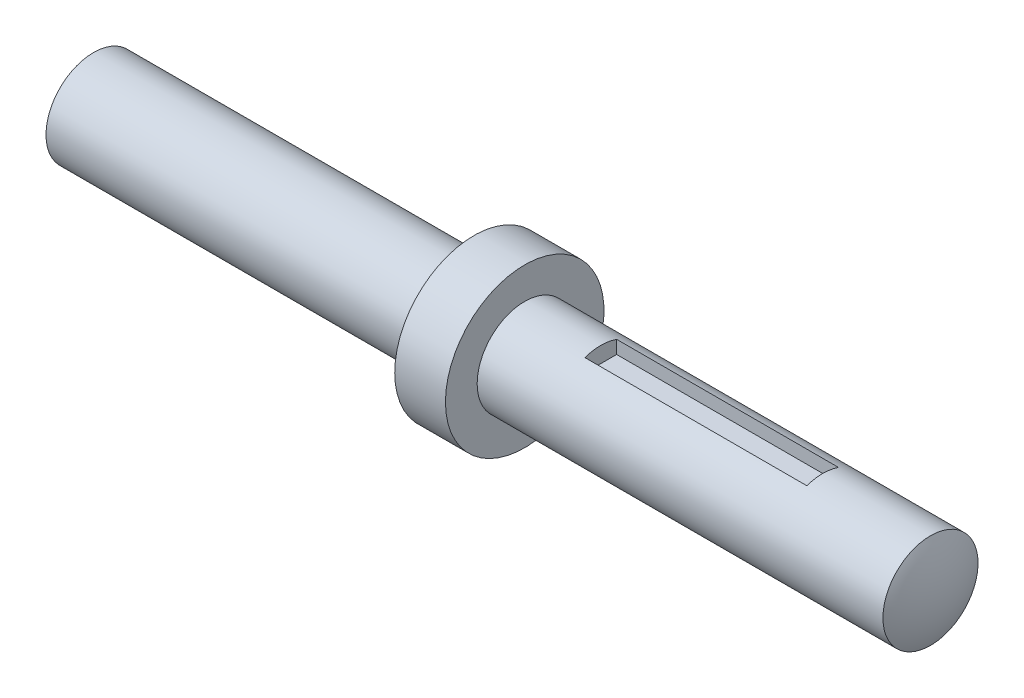
ISO-10303-21;
HEADER;
FILE_DESCRIPTION(('STEP AP214'),'2;1');
FILE_NAME('part.step','',(''),(''),'','','');
FILE_SCHEMA(('AUTOMOTIVE_DESIGN { 1 0 10303 214 1 1 1 1 }'));
ENDSEC;
DATA;
#1=APPLICATION_CONTEXT('core data for automotive mechanical design processes');
#2=APPLICATION_PROTOCOL_DEFINITION('international standard','automotive_design',2000,#1);
#3=PRODUCT_CONTEXT('',#1,'mechanical');
#4=PRODUCT('Part','Part','',(#3));
#5=PRODUCT_RELATED_PRODUCT_CATEGORY('part','',(#4));
#6=PRODUCT_DEFINITION_FORMATION('','',#4);
#7=PRODUCT_DEFINITION_CONTEXT('part definition',#1,'design');
#8=PRODUCT_DEFINITION('design','',#6,#7);
#9=PRODUCT_DEFINITION_SHAPE('','',#8);
#10=(LENGTH_UNIT() NAMED_UNIT(*) SI_UNIT(.MILLI.,.METRE.));
#11=(NAMED_UNIT(*) PLANE_ANGLE_UNIT() SI_UNIT($,.RADIAN.));
#12=(NAMED_UNIT(*) SI_UNIT($,.STERADIAN.) SOLID_ANGLE_UNIT());
#13=UNCERTAINTY_MEASURE_WITH_UNIT(LENGTH_MEASURE(1.E-05),#10,'distance_accuracy_value','');
#14=(GEOMETRIC_REPRESENTATION_CONTEXT(3) GLOBAL_UNCERTAINTY_ASSIGNED_CONTEXT((#13)) GLOBAL_UNIT_ASSIGNED_CONTEXT((#10,
#11,#12)) REPRESENTATION_CONTEXT('',''));
#15=CARTESIAN_POINT('',(0.,0.,0.));
#16=DIRECTION('',(0.,0.,1.));
#17=DIRECTION('',(1.,0.,0.));
#18=AXIS2_PLACEMENT_3D('',#15,#16,#17);
#19=CARTESIAN_POINT('',(-80.684854479656,0.,0.));
#20=DIRECTION('',(-1.,0.,0.));
#21=DIRECTION('',(0.,0.,1.));
#22=AXIS2_PLACEMENT_3D('',#19,#20,#21);
#23=CYLINDRICAL_SURFACE('',#22,7.5);
#24=CARTESIAN_POINT('',(-4.,0.,0.));
#25=DIRECTION('',(-1.,0.,0.));
#26=DIRECTION('',(0.,0.,1.));
#27=AXIS2_PLACEMENT_3D('',#24,#25,#26);
#28=CIRCLE('',#27,7.5);
#29=CARTESIAN_POINT('',(-4.,0.,7.5));
#30=VERTEX_POINT('',#29);
#31=EDGE_CURVE('E98',#30,#30,#28,.T.);
#32=ORIENTED_EDGE('',*,*,#31,.T.);
#33=EDGE_LOOP('',(#32));
#34=FACE_BOUND('',#33,.T.);
#35=CARTESIAN_POINT('',(-64.,0.,0.));
#36=DIRECTION('',(-1.,0.,0.));
#37=DIRECTION('',(0.,0.,1.));
#38=AXIS2_PLACEMENT_3D('',#35,#36,#37);
#39=CIRCLE('',#38,7.5);
#40=CARTESIAN_POINT('',(-64.,0.,7.5));
#41=VERTEX_POINT('',#40);
#42=EDGE_CURVE('E114',#41,#41,#39,.T.);
#43=ORIENTED_EDGE('',*,*,#42,.F.);
#44=EDGE_LOOP('',(#43));
#45=FACE_BOUND('',#44,.T.);
#46=ADVANCED_FACE('F34',(#34,#45),#23,.T.);
#47=CARTESIAN_POINT('',(-49.,0.,0.));
#48=DIRECTION('',(-1.,0.,0.));
#49=DIRECTION('',(0.,1.,0.));
#50=AXIS2_PLACEMENT_3D('',#47,#48,#49);
#51=SPHERICAL_SURFACE('',#50,16.7705098312484);
#52=ORIENTED_EDGE('',*,*,#42,.T.);
#53=EDGE_LOOP('',(#52));
#54=FACE_BOUND('',#53,.T.);
#55=ADVANCED_FACE('F137',(#54),#51,.T.);
#56=CARTESIAN_POINT('',(53.,0.,0.));
#57=DIRECTION('',(-1.,0.,0.));
#58=DIRECTION('',(0.,1.,0.));
#59=AXIS2_PLACEMENT_3D('',#56,#57,#58);
#60=SPHERICAL_SURFACE('',#59,16.7705098312484);
#61=CARTESIAN_POINT('',(68.,0.,0.));
#62=DIRECTION('',(-1.,0.,0.));
#63=DIRECTION('',(0.,0.,1.));
#64=AXIS2_PLACEMENT_3D('',#61,#62,#63);
#65=CIRCLE('',#64,7.5);
#66=CARTESIAN_POINT('',(68.,0.,7.5));
#67=VERTEX_POINT('',#66);
#68=EDGE_CURVE('E111',#67,#67,#65,.T.);
#69=ORIENTED_EDGE('',*,*,#68,.F.);
#70=EDGE_LOOP('',(#69));
#71=FACE_BOUND('',#70,.T.);
#72=ADVANCED_FACE('F142',(#71),#60,.T.);
#73=CARTESIAN_POINT('',(-80.684854479656,0.,0.));
#74=DIRECTION('',(-1.,0.,0.));
#75=DIRECTION('',(0.,0.,1.));
#76=AXIS2_PLACEMENT_3D('',#73,#74,#75);
#77=CYLINDRICAL_SURFACE('',#76,7.5);
#78=DIRECTION('',(-1.,0.,0.));
#79=VECTOR('',#78,1.);
#80=CARTESIAN_POINT('',(-80.684854479656,7.07106781186547,-2.5));
#81=LINE('',#80,#79);
#82=CARTESIAN_POINT('',(51.,7.07106781186547,-2.5));
#83=VERTEX_POINT('',#82);
#84=CARTESIAN_POINT('',(16.,7.07106781186547,-2.5));
#85=VERTEX_POINT('',#84);
#86=EDGE_CURVE('E11',#83,#85,#81,.T.);
#87=ORIENTED_EDGE('',*,*,#86,.F.);
#88=CARTESIAN_POINT('',(51.,0.,0.));
#89=DIRECTION('',(1.,0.,0.));
#90=DIRECTION('',(0.,0.,-1.));
#91=AXIS2_PLACEMENT_3D('',#88,#89,#90);
#92=CIRCLE('',#91,7.5);
#93=CARTESIAN_POINT('',(51.,7.07106781186547,2.5));
#94=VERTEX_POINT('',#93);
#95=EDGE_CURVE('E41',#94,#83,#92,.F.);
#96=ORIENTED_EDGE('',*,*,#95,.F.);
#97=DIRECTION('',(-1.,0.,0.));
#98=VECTOR('',#97,1.);
#99=CARTESIAN_POINT('',(-80.684854479656,7.07106781186547,2.5));
#100=LINE('',#99,#98);
#101=CARTESIAN_POINT('',(16.,7.07106781186547,2.5));
#102=VERTEX_POINT('',#101);
#103=EDGE_CURVE('E117',#94,#102,#100,.T.);
#104=ORIENTED_EDGE('',*,*,#103,.T.);
#105=CARTESIAN_POINT('',(16.,0.,0.));
#106=DIRECTION('',(-1.,0.,0.));
#107=DIRECTION('',(0.,0.,1.));
#108=AXIS2_PLACEMENT_3D('',#105,#106,#107);
#109=CIRCLE('',#108,7.5);
#110=EDGE_CURVE('E120',#85,#102,#109,.F.);
#111=ORIENTED_EDGE('',*,*,#110,.F.);
#112=EDGE_LOOP('',(#87,#96,#104,#111));
#113=FACE_BOUND('',#112,.T.);
#114=ORIENTED_EDGE('',*,*,#68,.T.);
#115=EDGE_LOOP('',(#114));
#116=FACE_BOUND('',#115,.T.);
#117=CARTESIAN_POINT('',(4.,0.,0.));
#118=DIRECTION('',(-1.,0.,0.));
#119=DIRECTION('',(0.,0.,1.));
#120=AXIS2_PLACEMENT_3D('',#117,#118,#119);
#121=CIRCLE('',#120,7.49999999999999);
#122=CARTESIAN_POINT('',(4.,0.,7.49999999999999));
#123=VERTEX_POINT('',#122);
#124=EDGE_CURVE('E108',#123,#123,#121,.T.);
#125=ORIENTED_EDGE('',*,*,#124,.F.);
#126=EDGE_LOOP('',(#125));
#127=FACE_BOUND('',#126,.T.);
#128=ADVANCED_FACE('F126',(#113,#116,#127),#77,.T.);
#129=CARTESIAN_POINT('',(4.,0.,0.));
#130=DIRECTION('',(1.,0.,0.));
#131=DIRECTION('',(0.,0.,-1.));
#132=AXIS2_PLACEMENT_3D('',#129,#130,#131);
#133=PLANE('',#132);
#134=ORIENTED_EDGE('',*,*,#124,.T.);
#135=EDGE_LOOP('',(#134));
#136=FACE_BOUND('',#135,.T.);
#137=CARTESIAN_POINT('',(4.,0.,0.));
#138=DIRECTION('',(-1.,0.,0.));
#139=DIRECTION('',(0.,0.,1.));
#140=AXIS2_PLACEMENT_3D('',#137,#138,#139);
#141=CIRCLE('',#140,12.5);
#142=CARTESIAN_POINT('',(4.,0.,12.5));
#143=VERTEX_POINT('',#142);
#144=EDGE_CURVE('E105',#143,#143,#141,.T.);
#145=ORIENTED_EDGE('',*,*,#144,.F.);
#146=EDGE_LOOP('',(#145));
#147=FACE_BOUND('',#146,.T.);
#148=ADVANCED_FACE('F157',(#136,#147),#133,.T.);
#149=CARTESIAN_POINT('',(-80.684854479656,0.,0.));
#150=DIRECTION('',(-1.,0.,0.));
#151=DIRECTION('',(0.,0.,1.));
#152=AXIS2_PLACEMENT_3D('',#149,#150,#151);
#153=CYLINDRICAL_SURFACE('',#152,12.5);
#154=ORIENTED_EDGE('',*,*,#144,.T.);
#155=EDGE_LOOP('',(#154));
#156=FACE_BOUND('',#155,.T.);
#157=CARTESIAN_POINT('',(-4.,0.,0.));
#158=DIRECTION('',(-1.,0.,0.));
#159=DIRECTION('',(0.,0.,1.));
#160=AXIS2_PLACEMENT_3D('',#157,#158,#159);
#161=CIRCLE('',#160,12.5);
#162=CARTESIAN_POINT('',(-4.,0.,12.5));
#163=VERTEX_POINT('',#162);
#164=EDGE_CURVE('E102',#163,#163,#161,.T.);
#165=ORIENTED_EDGE('',*,*,#164,.F.);
#166=EDGE_LOOP('',(#165));
#167=FACE_BOUND('',#166,.T.);
#168=ADVANCED_FACE('F150',(#156,#167),#153,.T.);
#169=CARTESIAN_POINT('',(-4.,0.,0.));
#170=DIRECTION('',(-1.,0.,0.));
#171=DIRECTION('',(0.,0.,1.));
#172=AXIS2_PLACEMENT_3D('',#169,#170,#171);
#173=PLANE('',#172);
#174=ORIENTED_EDGE('',*,*,#164,.T.);
#175=EDGE_LOOP('',(#174));
#176=FACE_BOUND('',#175,.T.);
#177=ORIENTED_EDGE('',*,*,#31,.F.);
#178=EDGE_LOOP('',(#177));
#179=FACE_BOUND('',#178,.T.);
#180=ADVANCED_FACE('F148',(#176,#179),#173,.T.);
#181=CARTESIAN_POINT('',(51.,9.99999999999999,-2.5));
#182=DIRECTION('',(1.,0.,0.));
#183=DIRECTION('',(0.,0.,-1.));
#184=AXIS2_PLACEMENT_3D('',#181,#182,#183);
#185=PLANE('',#184);
#186=ORIENTED_EDGE('',*,*,#95,.T.);
#187=DIRECTION('',(0.,1.,0.));
#188=VECTOR('',#187,1.);
#189=CARTESIAN_POINT('',(51.,9.99999999999999,-2.5));
#190=LINE('',#189,#188);
#191=CARTESIAN_POINT('',(51.,5.,-2.5));
#192=VERTEX_POINT('',#191);
#193=EDGE_CURVE('E87',#192,#83,#190,.T.);
#194=ORIENTED_EDGE('',*,*,#193,.F.);
#195=DIRECTION('',(0.,0.,1.));
#196=VECTOR('',#195,1.);
#197=CARTESIAN_POINT('',(51.,5.,-2.5));
#198=LINE('',#197,#196);
#199=CARTESIAN_POINT('',(51.,5.,2.5));
#200=VERTEX_POINT('',#199);
#201=EDGE_CURVE('E86',#192,#200,#198,.T.);
#202=ORIENTED_EDGE('',*,*,#201,.T.);
#203=DIRECTION('',(0.,1.,0.));
#204=VECTOR('',#203,1.);
#205=CARTESIAN_POINT('',(51.,9.99999999999999,2.5));
#206=LINE('',#205,#204);
#207=EDGE_CURVE('E79',#200,#94,#206,.T.);
#208=ORIENTED_EDGE('',*,*,#207,.T.);
#209=EDGE_LOOP('',(#186,#194,#202,#208));
#210=FACE_BOUND('',#209,.T.);
#211=ADVANCED_FACE('F123',(#210),#185,.F.);
#212=CARTESIAN_POINT('',(51.,5.,-2.5));
#213=DIRECTION('',(0.,-1.,0.));
#214=DIRECTION('',(1.,0.,0.));
#215=AXIS2_PLACEMENT_3D('',#212,#213,#214);
#216=PLANE('',#215);
#217=DIRECTION('',(1.,0.,0.));
#218=VECTOR('',#217,1.);
#219=CARTESIAN_POINT('',(51.,5.,2.5));
#220=LINE('',#219,#218);
#221=CARTESIAN_POINT('',(16.,4.99999999999999,2.5));
#222=VERTEX_POINT('',#221);
#223=EDGE_CURVE('E94',#222,#200,#220,.T.);
#224=ORIENTED_EDGE('',*,*,#223,.T.);
#225=ORIENTED_EDGE('',*,*,#201,.F.);
#226=DIRECTION('',(1.,0.,0.));
#227=VECTOR('',#226,1.);
#228=CARTESIAN_POINT('',(51.,5.,-2.5));
#229=LINE('',#228,#227);
#230=CARTESIAN_POINT('',(16.,4.99999999999999,-2.5));
#231=VERTEX_POINT('',#230);
#232=EDGE_CURVE('E75',#231,#192,#229,.T.);
#233=ORIENTED_EDGE('',*,*,#232,.F.);
#234=DIRECTION('',(0.,0.,1.));
#235=VECTOR('',#234,1.);
#236=CARTESIAN_POINT('',(16.,4.99999999999999,-2.5));
#237=LINE('',#236,#235);
#238=EDGE_CURVE('E82',#231,#222,#237,.T.);
#239=ORIENTED_EDGE('',*,*,#238,.T.);
#240=EDGE_LOOP('',(#224,#225,#233,#239));
#241=FACE_BOUND('',#240,.T.);
#242=ADVANCED_FACE('F89',(#241),#216,.F.);
#243=CARTESIAN_POINT('',(16.,4.99999999999999,-2.5));
#244=DIRECTION('',(-1.,0.,0.));
#245=DIRECTION('',(0.,0.,1.));
#246=AXIS2_PLACEMENT_3D('',#243,#244,#245);
#247=PLANE('',#246);
#248=ORIENTED_EDGE('',*,*,#110,.T.);
#249=DIRECTION('',(0.,-1.,0.));
#250=VECTOR('',#249,1.);
#251=CARTESIAN_POINT('',(16.,4.99999999999999,2.5));
#252=LINE('',#251,#250);
#253=EDGE_CURVE('E48',#102,#222,#252,.T.);
#254=ORIENTED_EDGE('',*,*,#253,.T.);
#255=ORIENTED_EDGE('',*,*,#238,.F.);
#256=DIRECTION('',(0.,-1.,0.));
#257=VECTOR('',#256,1.);
#258=CARTESIAN_POINT('',(16.,4.99999999999999,-2.5));
#259=LINE('',#258,#257);
#260=EDGE_CURVE('E71',#85,#231,#259,.T.);
#261=ORIENTED_EDGE('',*,*,#260,.F.);
#262=EDGE_LOOP('',(#248,#254,#255,#261));
#263=FACE_BOUND('',#262,.T.);
#264=ADVANCED_FACE('F83',(#263),#247,.F.);
#265=CARTESIAN_POINT('',(0.,0.,-2.5));
#266=DIRECTION('',(0.,0.,-1.));
#267=DIRECTION('',(-1.,0.,0.));
#268=AXIS2_PLACEMENT_3D('',#265,#266,#267);
#269=PLANE('',#268);
#270=ORIENTED_EDGE('',*,*,#86,.T.);
#271=ORIENTED_EDGE('',*,*,#260,.T.);
#272=ORIENTED_EDGE('',*,*,#232,.T.);
#273=ORIENTED_EDGE('',*,*,#193,.T.);
#274=EDGE_LOOP('',(#270,#271,#272,#273));
#275=FACE_BOUND('',#274,.T.);
#276=ADVANCED_FACE('F73',(#275),#269,.F.);
#277=CARTESIAN_POINT('',(0.,0.,2.5));
#278=DIRECTION('',(0.,0.,-1.));
#279=DIRECTION('',(-1.,0.,0.));
#280=AXIS2_PLACEMENT_3D('',#277,#278,#279);
#281=PLANE('',#280);
#282=ORIENTED_EDGE('',*,*,#207,.F.);
#283=ORIENTED_EDGE('',*,*,#223,.F.);
#284=ORIENTED_EDGE('',*,*,#253,.F.);
#285=ORIENTED_EDGE('',*,*,#103,.F.);
#286=EDGE_LOOP('',(#282,#283,#284,#285));
#287=FACE_BOUND('',#286,.T.);
#288=ADVANCED_FACE('F128',(#287),#281,.T.);
#289=CLOSED_SHELL('',(#46,#55,#72,#128,#148,#168,#180,#211,#242,#264,#276,#288));
#290=MANIFOLD_SOLID_BREP('B2',#289);
#291=ADVANCED_BREP_SHAPE_REPRESENTATION('',(#18,#290),#14);
#292=SHAPE_DEFINITION_REPRESENTATION(#9,#291);
ENDSEC;
END-ISO-10303-21;
